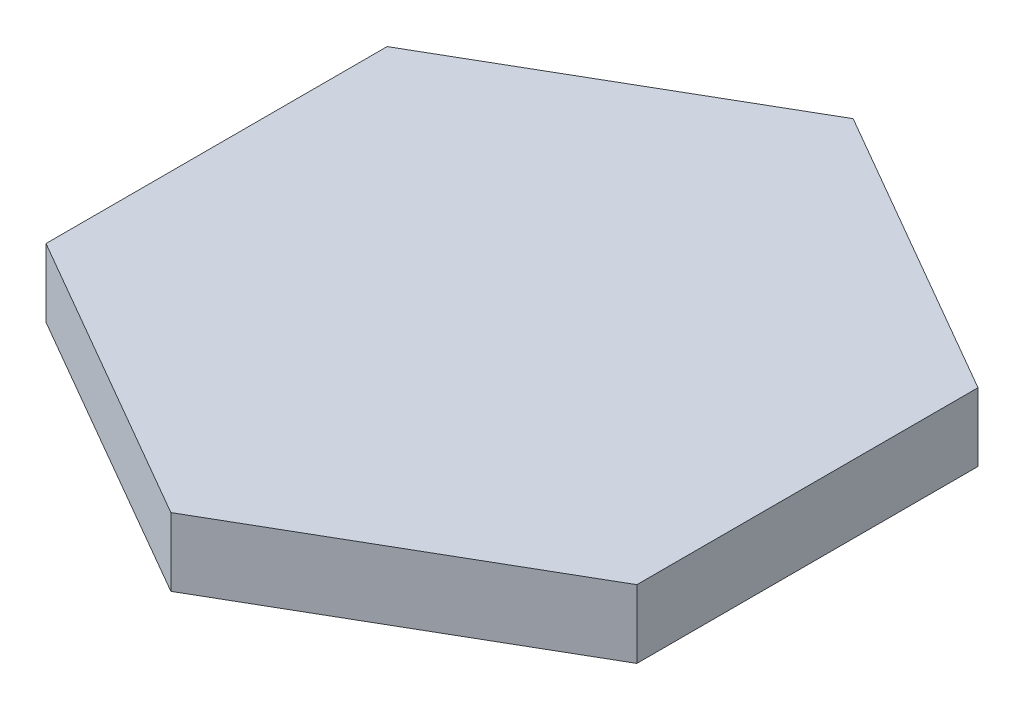
ISO-10303-21;
HEADER;
FILE_DESCRIPTION(('STEP AP214'),'2;1');
FILE_NAME('part.step','',(''),(''),'','','');
FILE_SCHEMA(('AUTOMOTIVE_DESIGN { 1 0 10303 214 1 1 1 1 }'));
ENDSEC;
DATA;
#1=APPLICATION_CONTEXT('core data for automotive mechanical design processes');
#2=APPLICATION_PROTOCOL_DEFINITION('international standard','automotive_design',2000,#1);
#3=PRODUCT_CONTEXT('',#1,'mechanical');
#4=PRODUCT('Part','Part','',(#3));
#5=PRODUCT_RELATED_PRODUCT_CATEGORY('part','',(#4));
#6=PRODUCT_DEFINITION_FORMATION('','',#4);
#7=PRODUCT_DEFINITION_CONTEXT('part definition',#1,'design');
#8=PRODUCT_DEFINITION('design','',#6,#7);
#9=PRODUCT_DEFINITION_SHAPE('','',#8);
#10=(LENGTH_UNIT() NAMED_UNIT(*) SI_UNIT(.MILLI.,.METRE.));
#11=(NAMED_UNIT(*) PLANE_ANGLE_UNIT() SI_UNIT($,.RADIAN.));
#12=(NAMED_UNIT(*) SI_UNIT($,.STERADIAN.) SOLID_ANGLE_UNIT());
#13=UNCERTAINTY_MEASURE_WITH_UNIT(LENGTH_MEASURE(1.E-05),#10,'distance_accuracy_value','');
#14=(GEOMETRIC_REPRESENTATION_CONTEXT(3) GLOBAL_UNCERTAINTY_ASSIGNED_CONTEXT((#13)) GLOBAL_UNIT_ASSIGNED_CONTEXT((#10,
#11,#12)) REPRESENTATION_CONTEXT('',''));
#15=CARTESIAN_POINT('',(0.,0.,0.));
#16=DIRECTION('',(0.,0.,1.));
#17=DIRECTION('',(1.,0.,0.));
#18=AXIS2_PLACEMENT_3D('',#15,#16,#17);
#19=CARTESIAN_POINT('',(64.9519052838329,15.,-37.5));
#20=DIRECTION('',(-0.5,0.,0.866025403784438));
#21=DIRECTION('',(0.866025403784439,0.,0.5));
#22=AXIS2_PLACEMENT_3D('',#19,#20,#21);
#23=PLANE('',#22);
#24=DIRECTION('',(-0.866025403784438,0.,-0.5));
#25=VECTOR('',#24,1.);
#26=CARTESIAN_POINT('',(64.9519052838329,0.,-37.5));
#27=LINE('',#26,#25);
#28=CARTESIAN_POINT('',(64.9519052838329,0.,-37.5));
#29=VERTEX_POINT('',#28);
#30=CARTESIAN_POINT('',(0.,0.,-75.));
#31=VERTEX_POINT('',#30);
#32=EDGE_CURVE('E118',#29,#31,#27,.T.);
#33=ORIENTED_EDGE('',*,*,#32,.T.);
#34=DIRECTION('',(0.,-1.,0.));
#35=VECTOR('',#34,1.);
#36=CARTESIAN_POINT('',(0.,15.,-75.));
#37=LINE('',#36,#35);
#38=CARTESIAN_POINT('',(0.,15.,-75.));
#39=VERTEX_POINT('',#38);
#40=EDGE_CURVE('E11',#39,#31,#37,.T.);
#41=ORIENTED_EDGE('',*,*,#40,.F.);
#42=DIRECTION('',(-0.866025403784438,0.,-0.5));
#43=VECTOR('',#42,1.);
#44=CARTESIAN_POINT('',(64.9519052838329,15.,-37.5));
#45=LINE('',#44,#43);
#46=CARTESIAN_POINT('',(64.9519052838329,15.,-37.5));
#47=VERTEX_POINT('',#46);
#48=EDGE_CURVE('E128',#47,#39,#45,.T.);
#49=ORIENTED_EDGE('',*,*,#48,.F.);
#50=DIRECTION('',(0.,-1.,0.));
#51=VECTOR('',#50,1.);
#52=CARTESIAN_POINT('',(64.9519052838329,15.,-37.5));
#53=LINE('',#52,#51);
#54=EDGE_CURVE('E114',#47,#29,#53,.T.);
#55=ORIENTED_EDGE('',*,*,#54,.T.);
#56=EDGE_LOOP('',(#33,#41,#49,#55));
#57=FACE_BOUND('',#56,.T.);
#58=ADVANCED_FACE('F34',(#57),#23,.F.);
#59=CARTESIAN_POINT('',(0.,15.,-75.));
#60=DIRECTION('',(0.5,0.,0.866025403784438));
#61=DIRECTION('',(0.866025403784439,0.,-0.5));
#62=AXIS2_PLACEMENT_3D('',#59,#60,#61);
#63=PLANE('',#62);
#64=DIRECTION('',(-0.866025403784438,0.,0.5));
#65=VECTOR('',#64,1.);
#66=CARTESIAN_POINT('',(0.,0.,-75.));
#67=LINE('',#66,#65);
#68=CARTESIAN_POINT('',(-64.9519052838329,0.,-37.5));
#69=VERTEX_POINT('',#68);
#70=EDGE_CURVE('E121',#31,#69,#67,.T.);
#71=ORIENTED_EDGE('',*,*,#70,.T.);
#72=DIRECTION('',(0.,-1.,0.));
#73=VECTOR('',#72,1.);
#74=CARTESIAN_POINT('',(-64.9519052838329,15.,-37.5));
#75=LINE('',#74,#73);
#76=CARTESIAN_POINT('',(-64.9519052838329,15.,-37.5));
#77=VERTEX_POINT('',#76);
#78=EDGE_CURVE('E42',#77,#69,#75,.T.);
#79=ORIENTED_EDGE('',*,*,#78,.F.);
#80=DIRECTION('',(-0.866025403784438,0.,0.5));
#81=VECTOR('',#80,1.);
#82=CARTESIAN_POINT('',(0.,15.,-75.));
#83=LINE('',#82,#81);
#84=EDGE_CURVE('E87',#39,#77,#83,.T.);
#85=ORIENTED_EDGE('',*,*,#84,.F.);
#86=ORIENTED_EDGE('',*,*,#40,.T.);
#87=EDGE_LOOP('',(#71,#79,#85,#86));
#88=FACE_BOUND('',#87,.T.);
#89=ADVANCED_FACE('F152',(#88),#63,.F.);
#90=CARTESIAN_POINT('',(-64.9519052838329,15.,-37.5));
#91=DIRECTION('',(1.,0.,0.));
#92=DIRECTION('',(0.,0.,-1.));
#93=AXIS2_PLACEMENT_3D('',#90,#91,#92);
#94=PLANE('',#93);
#95=DIRECTION('',(0.,0.,1.));
#96=VECTOR('',#95,1.);
#97=CARTESIAN_POINT('',(-64.9519052838329,0.,-37.5));
#98=LINE('',#97,#96);
#99=CARTESIAN_POINT('',(-64.9519052838329,0.,37.5));
#100=VERTEX_POINT('',#99);
#101=EDGE_CURVE('E123',#69,#100,#98,.T.);
#102=ORIENTED_EDGE('',*,*,#101,.T.);
#103=DIRECTION('',(0.,-1.,0.));
#104=VECTOR('',#103,1.);
#105=CARTESIAN_POINT('',(-64.9519052838329,15.,37.5));
#106=LINE('',#105,#104);
#107=CARTESIAN_POINT('',(-64.9519052838329,15.,37.5));
#108=VERTEX_POINT('',#107);
#109=EDGE_CURVE('E109',#108,#100,#106,.T.);
#110=ORIENTED_EDGE('',*,*,#109,.F.);
#111=DIRECTION('',(0.,0.,1.));
#112=VECTOR('',#111,1.);
#113=CARTESIAN_POINT('',(-64.9519052838329,15.,-37.5));
#114=LINE('',#113,#112);
#115=EDGE_CURVE('E100',#77,#108,#114,.T.);
#116=ORIENTED_EDGE('',*,*,#115,.F.);
#117=ORIENTED_EDGE('',*,*,#78,.T.);
#118=EDGE_LOOP('',(#102,#110,#116,#117));
#119=FACE_BOUND('',#118,.T.);
#120=ADVANCED_FACE('F134',(#119),#94,.F.);
#121=CARTESIAN_POINT('',(-64.9519052838329,15.,37.5));
#122=DIRECTION('',(0.5,0.,-0.866025403784438));
#123=DIRECTION('',(-0.866025403784439,0.,-0.5));
#124=AXIS2_PLACEMENT_3D('',#121,#122,#123);
#125=PLANE('',#124);
#126=DIRECTION('',(0.866025403784439,0.,0.5));
#127=VECTOR('',#126,1.);
#128=CARTESIAN_POINT('',(-64.9519052838329,0.,37.5));
#129=LINE('',#128,#127);
#130=CARTESIAN_POINT('',(0.,0.,75.));
#131=VERTEX_POINT('',#130);
#132=EDGE_CURVE('E108',#100,#131,#129,.T.);
#133=ORIENTED_EDGE('',*,*,#132,.T.);
#134=DIRECTION('',(0.,-1.,0.));
#135=VECTOR('',#134,1.);
#136=CARTESIAN_POINT('',(0.,15.,75.));
#137=LINE('',#136,#135);
#138=CARTESIAN_POINT('',(0.,15.,75.));
#139=VERTEX_POINT('',#138);
#140=EDGE_CURVE('E105',#139,#131,#137,.T.);
#141=ORIENTED_EDGE('',*,*,#140,.F.);
#142=DIRECTION('',(0.866025403784439,0.,0.5));
#143=VECTOR('',#142,1.);
#144=CARTESIAN_POINT('',(-64.9519052838329,15.,37.5));
#145=LINE('',#144,#143);
#146=EDGE_CURVE('E94',#108,#139,#145,.T.);
#147=ORIENTED_EDGE('',*,*,#146,.F.);
#148=ORIENTED_EDGE('',*,*,#109,.T.);
#149=EDGE_LOOP('',(#133,#141,#147,#148));
#150=FACE_BOUND('',#149,.T.);
#151=ADVANCED_FACE('F106',(#150),#125,.F.);
#152=CARTESIAN_POINT('',(0.,15.,75.));
#153=DIRECTION('',(-0.5,0.,-0.866025403784438));
#154=DIRECTION('',(-0.866025403784439,0.,0.5));
#155=AXIS2_PLACEMENT_3D('',#152,#153,#154);
#156=PLANE('',#155);
#157=DIRECTION('',(0.866025403784438,0.,-0.5));
#158=VECTOR('',#157,1.);
#159=CARTESIAN_POINT('',(0.,0.,75.));
#160=LINE('',#159,#158);
#161=CARTESIAN_POINT('',(64.9519052838329,0.,37.5));
#162=VERTEX_POINT('',#161);
#163=EDGE_CURVE('E73',#131,#162,#160,.T.);
#164=ORIENTED_EDGE('',*,*,#163,.T.);
#165=DIRECTION('',(0.,-1.,0.));
#166=VECTOR('',#165,1.);
#167=CARTESIAN_POINT('',(64.9519052838329,15.,37.5));
#168=LINE('',#167,#166);
#169=CARTESIAN_POINT('',(64.9519052838329,15.,37.5));
#170=VERTEX_POINT('',#169);
#171=EDGE_CURVE('E110',#170,#162,#168,.T.);
#172=ORIENTED_EDGE('',*,*,#171,.F.);
#173=DIRECTION('',(0.866025403784438,0.,-0.5));
#174=VECTOR('',#173,1.);
#175=CARTESIAN_POINT('',(0.,15.,75.));
#176=LINE('',#175,#174);
#177=EDGE_CURVE('E98',#139,#170,#176,.T.);
#178=ORIENTED_EDGE('',*,*,#177,.F.);
#179=ORIENTED_EDGE('',*,*,#140,.T.);
#180=EDGE_LOOP('',(#164,#172,#178,#179));
#181=FACE_BOUND('',#180,.T.);
#182=ADVANCED_FACE('F112',(#181),#156,.F.);
#183=CARTESIAN_POINT('',(64.9519052838329,15.,37.5));
#184=DIRECTION('',(-1.,0.,0.));
#185=DIRECTION('',(0.,0.,1.));
#186=AXIS2_PLACEMENT_3D('',#183,#184,#185);
#187=PLANE('',#186);
#188=DIRECTION('',(0.,0.,-1.));
#189=VECTOR('',#188,1.);
#190=CARTESIAN_POINT('',(64.9519052838329,0.,37.5));
#191=LINE('',#190,#189);
#192=EDGE_CURVE('E79',#162,#29,#191,.T.);
#193=ORIENTED_EDGE('',*,*,#192,.T.);
#194=ORIENTED_EDGE('',*,*,#54,.F.);
#195=DIRECTION('',(0.,0.,-1.));
#196=VECTOR('',#195,1.);
#197=CARTESIAN_POINT('',(64.9519052838329,15.,37.5));
#198=LINE('',#197,#196);
#199=EDGE_CURVE('E50',#170,#47,#198,.T.);
#200=ORIENTED_EDGE('',*,*,#199,.F.);
#201=ORIENTED_EDGE('',*,*,#171,.T.);
#202=EDGE_LOOP('',(#193,#194,#200,#201));
#203=FACE_BOUND('',#202,.T.);
#204=ADVANCED_FACE('F141',(#203),#187,.F.);
#205=CARTESIAN_POINT('',(0.,15.,0.));
#206=DIRECTION('',(0.,1.,0.));
#207=DIRECTION('',(0.,0.,1.));
#208=AXIS2_PLACEMENT_3D('',#205,#206,#207);
#209=PLANE('',#208);
#210=ORIENTED_EDGE('',*,*,#48,.T.);
#211=ORIENTED_EDGE('',*,*,#84,.T.);
#212=ORIENTED_EDGE('',*,*,#115,.T.);
#213=ORIENTED_EDGE('',*,*,#146,.T.);
#214=ORIENTED_EDGE('',*,*,#177,.T.);
#215=ORIENTED_EDGE('',*,*,#199,.T.);
#216=EDGE_LOOP('',(#210,#211,#212,#213,#214,#215));
#217=FACE_BOUND('',#216,.T.);
#218=ADVANCED_FACE('F96',(#217),#209,.T.);
#219=CARTESIAN_POINT('',(0.,0.,0.));
#220=DIRECTION('',(0.,1.,0.));
#221=DIRECTION('',(0.,0.,1.));
#222=AXIS2_PLACEMENT_3D('',#219,#220,#221);
#223=PLANE('',#222);
#224=ORIENTED_EDGE('',*,*,#32,.F.);
#225=ORIENTED_EDGE('',*,*,#192,.F.);
#226=ORIENTED_EDGE('',*,*,#163,.F.);
#227=ORIENTED_EDGE('',*,*,#132,.F.);
#228=ORIENTED_EDGE('',*,*,#101,.F.);
#229=ORIENTED_EDGE('',*,*,#70,.F.);
#230=EDGE_LOOP('',(#224,#225,#226,#227,#228,#229));
#231=FACE_BOUND('',#230,.T.);
#232=ADVANCED_FACE('F137',(#231),#223,.F.);
#233=CLOSED_SHELL('',(#58,#89,#120,#151,#182,#204,#218,#232));
#234=MANIFOLD_SOLID_BREP('B2',#233);
#235=ADVANCED_BREP_SHAPE_REPRESENTATION('',(#18,#234),#14);
#236=SHAPE_DEFINITION_REPRESENTATION(#9,#235);
ENDSEC;
END-ISO-10303-21;
